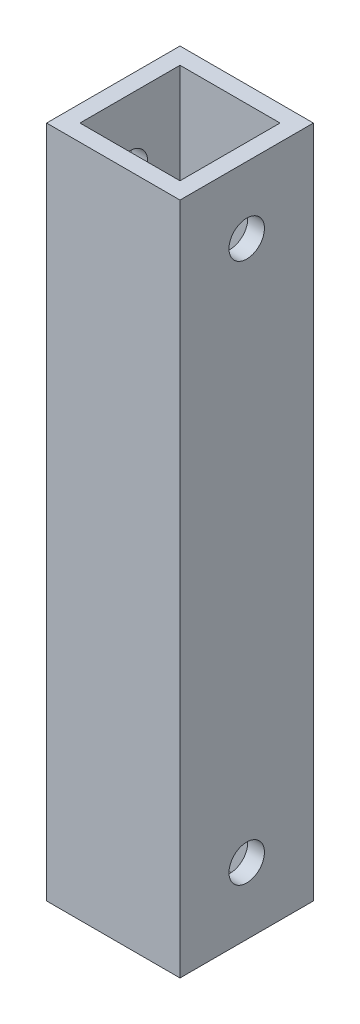
ISO-10303-21;
HEADER;
FILE_DESCRIPTION(('STEP AP214'),'2;1');
FILE_NAME('part.step','',(''),(''),'','','');
FILE_SCHEMA(('AUTOMOTIVE_DESIGN { 1 0 10303 214 1 1 1 1 }'));
ENDSEC;
DATA;
#1=APPLICATION_CONTEXT('core data for automotive mechanical design processes');
#2=APPLICATION_PROTOCOL_DEFINITION('international standard','automotive_design',2000,#1);
#3=PRODUCT_CONTEXT('',#1,'mechanical');
#4=PRODUCT('Part','Part','',(#3));
#5=PRODUCT_RELATED_PRODUCT_CATEGORY('part','',(#4));
#6=PRODUCT_DEFINITION_FORMATION('','',#4);
#7=PRODUCT_DEFINITION_CONTEXT('part definition',#1,'design');
#8=PRODUCT_DEFINITION('design','',#6,#7);
#9=PRODUCT_DEFINITION_SHAPE('','',#8);
#10=(LENGTH_UNIT() NAMED_UNIT(*) SI_UNIT(.MILLI.,.METRE.));
#11=(NAMED_UNIT(*) PLANE_ANGLE_UNIT() SI_UNIT($,.RADIAN.));
#12=(NAMED_UNIT(*) SI_UNIT($,.STERADIAN.) SOLID_ANGLE_UNIT());
#13=UNCERTAINTY_MEASURE_WITH_UNIT(LENGTH_MEASURE(1.E-05),#10,'distance_accuracy_value','');
#14=(GEOMETRIC_REPRESENTATION_CONTEXT(3) GLOBAL_UNCERTAINTY_ASSIGNED_CONTEXT((#13)) GLOBAL_UNIT_ASSIGNED_CONTEXT((#10,
#11,#12)) REPRESENTATION_CONTEXT('',''));
#15=CARTESIAN_POINT('',(0.,0.,0.));
#16=DIRECTION('',(0.,0.,1.));
#17=DIRECTION('',(1.,0.,0.));
#18=AXIS2_PLACEMENT_3D('',#15,#16,#17);
#19=CARTESIAN_POINT('',(0.,128.27,0.));
#20=DIRECTION('',(0.,-1.,0.));
#21=DIRECTION('',(0.,0.,-1.));
#22=AXIS2_PLACEMENT_3D('',#19,#20,#21);
#23=PLANE('',#22);
#24=DIRECTION('',(0.,0.,-1.));
#25=VECTOR('',#24,1.);
#26=CARTESIAN_POINT('',(12.7,128.27,12.7));
#27=LINE('',#26,#25);
#28=CARTESIAN_POINT('',(12.7,128.27,12.7));
#29=VERTEX_POINT('',#28);
#30=CARTESIAN_POINT('',(12.7,128.27,-12.7));
#31=VERTEX_POINT('',#30);
#32=EDGE_CURVE('E208',#29,#31,#27,.T.);
#33=ORIENTED_EDGE('',*,*,#32,.T.);
#34=DIRECTION('',(-1.,0.,0.));
#35=VECTOR('',#34,1.);
#36=CARTESIAN_POINT('',(-12.7,128.27,-12.7));
#37=LINE('',#36,#35);
#38=CARTESIAN_POINT('',(-12.7,128.27,-12.7));
#39=VERTEX_POINT('',#38);
#40=EDGE_CURVE('E211',#31,#39,#37,.T.);
#41=ORIENTED_EDGE('',*,*,#40,.T.);
#42=DIRECTION('',(0.,0.,1.));
#43=VECTOR('',#42,1.);
#44=CARTESIAN_POINT('',(-12.7,128.27,12.7));
#45=LINE('',#44,#43);
#46=CARTESIAN_POINT('',(-12.7,128.27,12.7));
#47=VERTEX_POINT('',#46);
#48=EDGE_CURVE('E214',#39,#47,#45,.T.);
#49=ORIENTED_EDGE('',*,*,#48,.T.);
#50=DIRECTION('',(1.,0.,0.));
#51=VECTOR('',#50,1.);
#52=CARTESIAN_POINT('',(-12.7,128.27,12.7));
#53=LINE('',#52,#51);
#54=EDGE_CURVE('E216',#47,#29,#53,.T.);
#55=ORIENTED_EDGE('',*,*,#54,.T.);
#56=EDGE_LOOP('',(#33,#41,#49,#55));
#57=FACE_BOUND('',#56,.T.);
#58=DIRECTION('',(0.,0.,1.));
#59=VECTOR('',#58,1.);
#60=CARTESIAN_POINT('',(-9.525,128.27,9.525));
#61=LINE('',#60,#59);
#62=CARTESIAN_POINT('',(-9.525,128.27,-9.525));
#63=VERTEX_POINT('',#62);
#64=CARTESIAN_POINT('',(-9.525,128.27,9.525));
#65=VERTEX_POINT('',#64);
#66=EDGE_CURVE('E176',#63,#65,#61,.T.);
#67=ORIENTED_EDGE('',*,*,#66,.F.);
#68=DIRECTION('',(-1.,0.,0.));
#69=VECTOR('',#68,1.);
#70=CARTESIAN_POINT('',(-9.525,128.27,-9.525));
#71=LINE('',#70,#69);
#72=CARTESIAN_POINT('',(9.525,128.27,-9.525));
#73=VERTEX_POINT('',#72);
#74=EDGE_CURVE('E184',#73,#63,#71,.T.);
#75=ORIENTED_EDGE('',*,*,#74,.F.);
#76=DIRECTION('',(0.,0.,-1.));
#77=VECTOR('',#76,1.);
#78=CARTESIAN_POINT('',(9.525,128.27,9.525));
#79=LINE('',#78,#77);
#80=CARTESIAN_POINT('',(9.525,128.27,9.525));
#81=VERTEX_POINT('',#80);
#82=EDGE_CURVE('E181',#81,#73,#79,.T.);
#83=ORIENTED_EDGE('',*,*,#82,.F.);
#84=DIRECTION('',(1.,0.,0.));
#85=VECTOR('',#84,1.);
#86=CARTESIAN_POINT('',(-9.525,128.27,9.525));
#87=LINE('',#86,#85);
#88=EDGE_CURVE('E178',#65,#81,#87,.T.);
#89=ORIENTED_EDGE('',*,*,#88,.F.);
#90=EDGE_LOOP('',(#67,#75,#83,#89));
#91=FACE_BOUND('',#90,.T.);
#92=ADVANCED_FACE('F33',(#57,#91),#23,.F.);
#93=CARTESIAN_POINT('',(0.,0.,0.));
#94=DIRECTION('',(0.,-1.,0.));
#95=DIRECTION('',(0.,0.,-1.));
#96=AXIS2_PLACEMENT_3D('',#93,#94,#95);
#97=PLANE('',#96);
#98=DIRECTION('',(0.,0.,-1.));
#99=VECTOR('',#98,1.);
#100=CARTESIAN_POINT('',(12.7,0.,12.7));
#101=LINE('',#100,#99);
#102=CARTESIAN_POINT('',(12.7,0.,12.7));
#103=VERTEX_POINT('',#102);
#104=CARTESIAN_POINT('',(12.7,0.,-12.7));
#105=VERTEX_POINT('',#104);
#106=EDGE_CURVE('E207',#103,#105,#101,.T.);
#107=ORIENTED_EDGE('',*,*,#106,.F.);
#108=DIRECTION('',(1.,0.,0.));
#109=VECTOR('',#108,1.);
#110=CARTESIAN_POINT('',(-12.7,0.,12.7));
#111=LINE('',#110,#109);
#112=CARTESIAN_POINT('',(-12.7,0.,12.7));
#113=VERTEX_POINT('',#112);
#114=EDGE_CURVE('E212',#113,#103,#111,.T.);
#115=ORIENTED_EDGE('',*,*,#114,.F.);
#116=DIRECTION('',(0.,0.,1.));
#117=VECTOR('',#116,1.);
#118=CARTESIAN_POINT('',(-12.7,0.,12.7));
#119=LINE('',#118,#117);
#120=CARTESIAN_POINT('',(-12.7,0.,-12.7));
#121=VERTEX_POINT('',#120);
#122=EDGE_CURVE('E224',#121,#113,#119,.T.);
#123=ORIENTED_EDGE('',*,*,#122,.F.);
#124=DIRECTION('',(-1.,0.,0.));
#125=VECTOR('',#124,1.);
#126=CARTESIAN_POINT('',(-12.7,0.,-12.7));
#127=LINE('',#126,#125);
#128=EDGE_CURVE('E221',#105,#121,#127,.T.);
#129=ORIENTED_EDGE('',*,*,#128,.F.);
#130=EDGE_LOOP('',(#107,#115,#123,#129));
#131=FACE_BOUND('',#130,.T.);
#132=DIRECTION('',(-1.,0.,0.));
#133=VECTOR('',#132,1.);
#134=CARTESIAN_POINT('',(-9.525,0.,-9.525));
#135=LINE('',#134,#133);
#136=CARTESIAN_POINT('',(9.525,0.,-9.525));
#137=VERTEX_POINT('',#136);
#138=CARTESIAN_POINT('',(-9.525,0.,-9.525));
#139=VERTEX_POINT('',#138);
#140=EDGE_CURVE('E179',#137,#139,#135,.T.);
#141=ORIENTED_EDGE('',*,*,#140,.T.);
#142=DIRECTION('',(0.,0.,1.));
#143=VECTOR('',#142,1.);
#144=CARTESIAN_POINT('',(-9.525,0.,9.525));
#145=LINE('',#144,#143);
#146=CARTESIAN_POINT('',(-9.525,0.,9.525));
#147=VERTEX_POINT('',#146);
#148=EDGE_CURVE('E175',#139,#147,#145,.T.);
#149=ORIENTED_EDGE('',*,*,#148,.T.);
#150=DIRECTION('',(1.,0.,0.));
#151=VECTOR('',#150,1.);
#152=CARTESIAN_POINT('',(-9.525,0.,9.525));
#153=LINE('',#152,#151);
#154=CARTESIAN_POINT('',(9.525,0.,9.525));
#155=VERTEX_POINT('',#154);
#156=EDGE_CURVE('E189',#147,#155,#153,.T.);
#157=ORIENTED_EDGE('',*,*,#156,.T.);
#158=DIRECTION('',(0.,0.,-1.));
#159=VECTOR('',#158,1.);
#160=CARTESIAN_POINT('',(9.525,0.,9.525));
#161=LINE('',#160,#159);
#162=EDGE_CURVE('E192',#155,#137,#161,.T.);
#163=ORIENTED_EDGE('',*,*,#162,.T.);
#164=EDGE_LOOP('',(#141,#149,#157,#163));
#165=FACE_BOUND('',#164,.T.);
#166=ADVANCED_FACE('F288',(#131,#165),#97,.T.);
#167=CARTESIAN_POINT('',(12.7,128.27,12.7));
#168=DIRECTION('',(-1.,0.,0.));
#169=DIRECTION('',(0.,0.,1.));
#170=AXIS2_PLACEMENT_3D('',#167,#168,#169);
#171=PLANE('',#170);
#172=CARTESIAN_POINT('',(12.7,12.7,0.));
#173=DIRECTION('',(1.,0.,0.));
#174=DIRECTION('',(0.,0.,-1.));
#175=AXIS2_PLACEMENT_3D('',#172,#173,#174);
#176=CIRCLE('',#175,3.3734375);
#177=CARTESIAN_POINT('',(12.7,12.7,-3.3734375));
#178=VERTEX_POINT('',#177);
#179=EDGE_CURVE('E423',#178,#178,#176,.T.);
#180=ORIENTED_EDGE('',*,*,#179,.F.);
#181=EDGE_LOOP('',(#180));
#182=FACE_BOUND('',#181,.T.);
#183=CARTESIAN_POINT('',(12.7,115.57,0.));
#184=DIRECTION('',(1.,0.,0.));
#185=DIRECTION('',(0.,0.,-1.));
#186=AXIS2_PLACEMENT_3D('',#183,#184,#185);
#187=CIRCLE('',#186,3.3734375);
#188=CARTESIAN_POINT('',(12.7,115.57,-3.3734375));
#189=VERTEX_POINT('',#188);
#190=EDGE_CURVE('E249',#189,#189,#187,.T.);
#191=ORIENTED_EDGE('',*,*,#190,.F.);
#192=EDGE_LOOP('',(#191));
#193=FACE_BOUND('',#192,.T.);
#194=ORIENTED_EDGE('',*,*,#106,.T.);
#195=DIRECTION('',(0.,-1.,0.));
#196=VECTOR('',#195,1.);
#197=CARTESIAN_POINT('',(12.7,128.27,-12.7));
#198=LINE('',#197,#196);
#199=EDGE_CURVE('E235',#31,#105,#198,.T.);
#200=ORIENTED_EDGE('',*,*,#199,.F.);
#201=ORIENTED_EDGE('',*,*,#32,.F.);
#202=DIRECTION('',(0.,-1.,0.));
#203=VECTOR('',#202,1.);
#204=CARTESIAN_POINT('',(12.7,128.27,12.7));
#205=LINE('',#204,#203);
#206=EDGE_CURVE('E218',#29,#103,#205,.T.);
#207=ORIENTED_EDGE('',*,*,#206,.T.);
#208=EDGE_LOOP('',(#194,#200,#201,#207));
#209=FACE_BOUND('',#208,.T.);
#210=ADVANCED_FACE('F35',(#182,#193,#209),#171,.F.);
#211=CARTESIAN_POINT('',(-12.7,128.27,-12.7));
#212=DIRECTION('',(0.,0.,1.));
#213=DIRECTION('',(1.,0.,0.));
#214=AXIS2_PLACEMENT_3D('',#211,#212,#213);
#215=PLANE('',#214);
#216=DIRECTION('',(0.,-1.,0.));
#217=VECTOR('',#216,1.);
#218=CARTESIAN_POINT('',(-12.7,128.27,-12.7));
#219=LINE('',#218,#217);
#220=CARTESIAN_POINT('',(-12.7,38.1,-12.7));
#221=VERTEX_POINT('',#220);
#222=EDGE_CURVE('E232',#221,#121,#219,.T.);
#223=ORIENTED_EDGE('',*,*,#222,.F.);
#224=DIRECTION('',(-1.,0.,0.));
#225=VECTOR('',#224,1.);
#226=CARTESIAN_POINT('',(-41.6854634885415,38.1,-12.7));
#227=LINE('',#226,#225);
#228=CARTESIAN_POINT('',(5.08,38.1,-12.7));
#229=VERTEX_POINT('',#228);
#230=EDGE_CURVE('E158',#229,#221,#227,.T.);
#231=ORIENTED_EDGE('',*,*,#230,.F.);
#232=DIRECTION('',(0.,-1.,0.));
#233=VECTOR('',#232,1.);
#234=CARTESIAN_POINT('',(5.08,38.1,-12.7));
#235=LINE('',#234,#233);
#236=CARTESIAN_POINT('',(5.08,50.8,-12.7));
#237=VERTEX_POINT('',#236);
#238=EDGE_CURVE('E138',#237,#229,#235,.T.);
#239=ORIENTED_EDGE('',*,*,#238,.F.);
#240=DIRECTION('',(1.,0.,0.));
#241=VECTOR('',#240,1.);
#242=CARTESIAN_POINT('',(-41.6854634885415,50.8,-12.7));
#243=LINE('',#242,#241);
#244=CARTESIAN_POINT('',(-12.7,50.8,-12.7));
#245=VERTEX_POINT('',#244);
#246=EDGE_CURVE('E146',#245,#237,#243,.T.);
#247=ORIENTED_EDGE('',*,*,#246,.F.);
#248=EDGE_CURVE('E233',#39,#245,#219,.T.);
#249=ORIENTED_EDGE('',*,*,#248,.F.);
#250=ORIENTED_EDGE('',*,*,#40,.F.);
#251=ORIENTED_EDGE('',*,*,#199,.T.);
#252=ORIENTED_EDGE('',*,*,#128,.T.);
#253=EDGE_LOOP('',(#223,#231,#239,#247,#249,#250,#251,#252));
#254=FACE_BOUND('',#253,.T.);
#255=ADVANCED_FACE('F157',(#254),#215,.F.);
#256=CARTESIAN_POINT('',(-12.7,128.27,12.7));
#257=DIRECTION('',(1.,0.,0.));
#258=DIRECTION('',(0.,0.,-1.));
#259=AXIS2_PLACEMENT_3D('',#256,#257,#258);
#260=PLANE('',#259);
#261=CARTESIAN_POINT('',(-12.7,12.7,0.));
#262=DIRECTION('',(1.,0.,0.));
#263=DIRECTION('',(0.,0.,-1.));
#264=AXIS2_PLACEMENT_3D('',#261,#262,#263);
#265=CIRCLE('',#264,3.3734375);
#266=CARTESIAN_POINT('',(-12.7,12.7,-3.3734375));
#267=VERTEX_POINT('',#266);
#268=EDGE_CURVE('E422',#267,#267,#265,.T.);
#269=ORIENTED_EDGE('',*,*,#268,.T.);
#270=EDGE_LOOP('',(#269));
#271=FACE_BOUND('',#270,.T.);
#272=CARTESIAN_POINT('',(-12.7,115.57,0.));
#273=DIRECTION('',(1.,0.,0.));
#274=DIRECTION('',(0.,0.,-1.));
#275=AXIS2_PLACEMENT_3D('',#272,#273,#274);
#276=CIRCLE('',#275,3.3734375);
#277=CARTESIAN_POINT('',(-12.7,115.57,-3.3734375));
#278=VERTEX_POINT('',#277);
#279=EDGE_CURVE('E243',#278,#278,#276,.T.);
#280=ORIENTED_EDGE('',*,*,#279,.T.);
#281=EDGE_LOOP('',(#280));
#282=FACE_BOUND('',#281,.T.);
#283=DIRECTION('',(0.,1.,0.));
#284=VECTOR('',#283,1.);
#285=CARTESIAN_POINT('',(-12.7,128.27,0.));
#286=LINE('',#285,#284);
#287=CARTESIAN_POINT('',(-12.7,38.1,0.));
#288=VERTEX_POINT('',#287);
#289=CARTESIAN_POINT('',(-12.7,50.8,0.));
#290=VERTEX_POINT('',#289);
#291=EDGE_CURVE('E173',#288,#290,#286,.T.);
#292=ORIENTED_EDGE('',*,*,#291,.F.);
#293=DIRECTION('',(0.,0.,-1.));
#294=VECTOR('',#293,1.);
#295=CARTESIAN_POINT('',(-12.7,38.1,12.7));
#296=LINE('',#295,#294);
#297=EDGE_CURVE('E170',#288,#221,#296,.T.);
#298=ORIENTED_EDGE('',*,*,#297,.T.);
#299=ORIENTED_EDGE('',*,*,#222,.T.);
#300=ORIENTED_EDGE('',*,*,#122,.T.);
#301=DIRECTION('',(0.,-1.,0.));
#302=VECTOR('',#301,1.);
#303=CARTESIAN_POINT('',(-12.7,128.27,12.7));
#304=LINE('',#303,#302);
#305=EDGE_CURVE('E229',#47,#113,#304,.T.);
#306=ORIENTED_EDGE('',*,*,#305,.F.);
#307=ORIENTED_EDGE('',*,*,#48,.F.);
#308=ORIENTED_EDGE('',*,*,#248,.T.);
#309=DIRECTION('',(0.,0.,1.));
#310=VECTOR('',#309,1.);
#311=CARTESIAN_POINT('',(-12.7,50.8,12.7));
#312=LINE('',#311,#310);
#313=EDGE_CURVE('E150',#245,#290,#312,.T.);
#314=ORIENTED_EDGE('',*,*,#313,.T.);
#315=EDGE_LOOP('',(#292,#298,#299,#300,#306,#307,#308,#314));
#316=FACE_BOUND('',#315,.T.);
#317=ADVANCED_FACE('F306',(#271,#282,#316),#260,.F.);
#318=CARTESIAN_POINT('',(-12.7,128.27,12.7));
#319=DIRECTION('',(0.,0.,-1.));
#320=DIRECTION('',(-1.,0.,0.));
#321=AXIS2_PLACEMENT_3D('',#318,#319,#320);
#322=PLANE('',#321);
#323=ORIENTED_EDGE('',*,*,#114,.T.);
#324=ORIENTED_EDGE('',*,*,#206,.F.);
#325=ORIENTED_EDGE('',*,*,#54,.F.);
#326=ORIENTED_EDGE('',*,*,#305,.T.);
#327=EDGE_LOOP('',(#323,#324,#325,#326));
#328=FACE_BOUND('',#327,.T.);
#329=ADVANCED_FACE('F303',(#328),#322,.F.);
#330=CARTESIAN_POINT('',(-9.525,128.27,9.525));
#331=DIRECTION('',(1.,0.,0.));
#332=DIRECTION('',(0.,0.,-1.));
#333=AXIS2_PLACEMENT_3D('',#330,#331,#332);
#334=PLANE('',#333);
#335=CARTESIAN_POINT('',(-9.525,12.7,0.));
#336=DIRECTION('',(1.,0.,0.));
#337=DIRECTION('',(0.,0.,-1.));
#338=AXIS2_PLACEMENT_3D('',#335,#336,#337);
#339=CIRCLE('',#338,3.3734375);
#340=CARTESIAN_POINT('',(-9.525,12.7,-3.3734375));
#341=VERTEX_POINT('',#340);
#342=EDGE_CURVE('E254',#341,#341,#339,.T.);
#343=ORIENTED_EDGE('',*,*,#342,.F.);
#344=EDGE_LOOP('',(#343));
#345=FACE_BOUND('',#344,.T.);
#346=CARTESIAN_POINT('',(-9.525,115.57,0.));
#347=DIRECTION('',(1.,0.,0.));
#348=DIRECTION('',(0.,0.,-1.));
#349=AXIS2_PLACEMENT_3D('',#346,#347,#348);
#350=CIRCLE('',#349,3.3734375);
#351=CARTESIAN_POINT('',(-9.525,115.57,-3.3734375));
#352=VERTEX_POINT('',#351);
#353=EDGE_CURVE('E154',#352,#352,#350,.T.);
#354=ORIENTED_EDGE('',*,*,#353,.F.);
#355=EDGE_LOOP('',(#354));
#356=FACE_BOUND('',#355,.T.);
#357=DIRECTION('',(0.,0.,-1.));
#358=VECTOR('',#357,1.);
#359=CARTESIAN_POINT('',(-9.525,38.1,9.525));
#360=LINE('',#359,#358);
#361=CARTESIAN_POINT('',(-9.525,38.1,0.));
#362=VERTEX_POINT('',#361);
#363=CARTESIAN_POINT('',(-9.525,38.1,-9.525));
#364=VERTEX_POINT('',#363);
#365=EDGE_CURVE('E168',#362,#364,#360,.T.);
#366=ORIENTED_EDGE('',*,*,#365,.F.);
#367=DIRECTION('',(0.,1.,0.));
#368=VECTOR('',#367,1.);
#369=CARTESIAN_POINT('',(-9.525,128.27,0.));
#370=LINE('',#369,#368);
#371=CARTESIAN_POINT('',(-9.525,50.8,0.));
#372=VERTEX_POINT('',#371);
#373=EDGE_CURVE('E11',#362,#372,#370,.T.);
#374=ORIENTED_EDGE('',*,*,#373,.T.);
#375=DIRECTION('',(0.,0.,1.));
#376=VECTOR('',#375,1.);
#377=CARTESIAN_POINT('',(-9.525,50.8,9.525));
#378=LINE('',#377,#376);
#379=CARTESIAN_POINT('',(-9.525,50.8,-9.525));
#380=VERTEX_POINT('',#379);
#381=EDGE_CURVE('E164',#380,#372,#378,.T.);
#382=ORIENTED_EDGE('',*,*,#381,.F.);
#383=DIRECTION('',(0.,-1.,0.));
#384=VECTOR('',#383,1.);
#385=CARTESIAN_POINT('',(-9.525,128.27,-9.525));
#386=LINE('',#385,#384);
#387=EDGE_CURVE('E197',#63,#380,#386,.T.);
#388=ORIENTED_EDGE('',*,*,#387,.F.);
#389=ORIENTED_EDGE('',*,*,#66,.T.);
#390=DIRECTION('',(0.,-1.,0.));
#391=VECTOR('',#390,1.);
#392=CARTESIAN_POINT('',(-9.525,128.27,9.525));
#393=LINE('',#392,#391);
#394=EDGE_CURVE('E204',#65,#147,#393,.T.);
#395=ORIENTED_EDGE('',*,*,#394,.T.);
#396=ORIENTED_EDGE('',*,*,#148,.F.);
#397=EDGE_CURVE('E186',#364,#139,#386,.T.);
#398=ORIENTED_EDGE('',*,*,#397,.F.);
#399=EDGE_LOOP('',(#366,#374,#382,#388,#389,#395,#396,#398));
#400=FACE_BOUND('',#399,.T.);
#401=ADVANCED_FACE('F265',(#345,#356,#400),#334,.T.);
#402=CARTESIAN_POINT('',(-9.525,128.27,9.525));
#403=DIRECTION('',(0.,0.,-1.));
#404=DIRECTION('',(-1.,0.,0.));
#405=AXIS2_PLACEMENT_3D('',#402,#403,#404);
#406=PLANE('',#405);
#407=ORIENTED_EDGE('',*,*,#156,.F.);
#408=ORIENTED_EDGE('',*,*,#394,.F.);
#409=ORIENTED_EDGE('',*,*,#88,.T.);
#410=DIRECTION('',(0.,-1.,0.));
#411=VECTOR('',#410,1.);
#412=CARTESIAN_POINT('',(9.525,128.27,9.525));
#413=LINE('',#412,#411);
#414=EDGE_CURVE('E202',#81,#155,#413,.T.);
#415=ORIENTED_EDGE('',*,*,#414,.T.);
#416=EDGE_LOOP('',(#407,#408,#409,#415));
#417=FACE_BOUND('',#416,.T.);
#418=ADVANCED_FACE('F283',(#417),#406,.T.);
#419=CARTESIAN_POINT('',(9.525,128.27,9.525));
#420=DIRECTION('',(-1.,0.,0.));
#421=DIRECTION('',(0.,0.,1.));
#422=AXIS2_PLACEMENT_3D('',#419,#420,#421);
#423=PLANE('',#422);
#424=CARTESIAN_POINT('',(9.525,12.7,0.));
#425=DIRECTION('',(-1.,0.,0.));
#426=DIRECTION('',(0.,0.,1.));
#427=AXIS2_PLACEMENT_3D('',#424,#425,#426);
#428=CIRCLE('',#427,3.3734375);
#429=CARTESIAN_POINT('',(9.525,12.7,3.3734375));
#430=VERTEX_POINT('',#429);
#431=EDGE_CURVE('E37',#430,#430,#428,.T.);
#432=ORIENTED_EDGE('',*,*,#431,.F.);
#433=EDGE_LOOP('',(#432));
#434=FACE_BOUND('',#433,.T.);
#435=CARTESIAN_POINT('',(9.525,115.57,0.));
#436=DIRECTION('',(-1.,0.,0.));
#437=DIRECTION('',(0.,0.,1.));
#438=AXIS2_PLACEMENT_3D('',#435,#436,#437);
#439=CIRCLE('',#438,3.3734375);
#440=CARTESIAN_POINT('',(9.525,115.57,3.3734375));
#441=VERTEX_POINT('',#440);
#442=EDGE_CURVE('E241',#441,#441,#439,.T.);
#443=ORIENTED_EDGE('',*,*,#442,.F.);
#444=EDGE_LOOP('',(#443));
#445=FACE_BOUND('',#444,.T.);
#446=ORIENTED_EDGE('',*,*,#162,.F.);
#447=ORIENTED_EDGE('',*,*,#414,.F.);
#448=ORIENTED_EDGE('',*,*,#82,.T.);
#449=DIRECTION('',(0.,-1.,0.));
#450=VECTOR('',#449,1.);
#451=CARTESIAN_POINT('',(9.525,128.27,-9.525));
#452=LINE('',#451,#450);
#453=EDGE_CURVE('E200',#73,#137,#452,.T.);
#454=ORIENTED_EDGE('',*,*,#453,.T.);
#455=EDGE_LOOP('',(#446,#447,#448,#454));
#456=FACE_BOUND('',#455,.T.);
#457=ADVANCED_FACE('F286',(#434,#445,#456),#423,.T.);
#458=CARTESIAN_POINT('',(-9.525,128.27,-9.525));
#459=DIRECTION('',(0.,0.,1.));
#460=DIRECTION('',(1.,0.,0.));
#461=AXIS2_PLACEMENT_3D('',#458,#459,#460);
#462=PLANE('',#461);
#463=DIRECTION('',(1.,0.,0.));
#464=VECTOR('',#463,1.);
#465=CARTESIAN_POINT('',(-9.52500000000001,38.1,-9.525));
#466=LINE('',#465,#464);
#467=CARTESIAN_POINT('',(5.08,38.1,-9.525));
#468=VERTEX_POINT('',#467);
#469=EDGE_CURVE('E42',#364,#468,#466,.T.);
#470=ORIENTED_EDGE('',*,*,#469,.F.);
#471=ORIENTED_EDGE('',*,*,#397,.T.);
#472=ORIENTED_EDGE('',*,*,#140,.F.);
#473=ORIENTED_EDGE('',*,*,#453,.F.);
#474=ORIENTED_EDGE('',*,*,#74,.T.);
#475=ORIENTED_EDGE('',*,*,#387,.T.);
#476=DIRECTION('',(-1.,0.,0.));
#477=VECTOR('',#476,1.);
#478=CARTESIAN_POINT('',(-9.52500000000001,50.8,-9.525));
#479=LINE('',#478,#477);
#480=CARTESIAN_POINT('',(5.08,50.8,-9.525));
#481=VERTEX_POINT('',#480);
#482=EDGE_CURVE('E238',#481,#380,#479,.T.);
#483=ORIENTED_EDGE('',*,*,#482,.F.);
#484=DIRECTION('',(0.,1.,0.));
#485=VECTOR('',#484,1.);
#486=CARTESIAN_POINT('',(5.08000000000001,128.27,-9.525));
#487=LINE('',#486,#485);
#488=EDGE_CURVE('E141',#468,#481,#487,.T.);
#489=ORIENTED_EDGE('',*,*,#488,.F.);
#490=EDGE_LOOP('',(#470,#471,#472,#473,#474,#475,#483,#489));
#491=FACE_BOUND('',#490,.T.);
#492=ADVANCED_FACE('F273',(#491),#462,.T.);
#493=CARTESIAN_POINT('',(0.,0.,0.));
#494=DIRECTION('',(0.,0.,-1.));
#495=DIRECTION('',(-1.,0.,0.));
#496=AXIS2_PLACEMENT_3D('',#493,#494,#495);
#497=PLANE('',#496);
#498=ORIENTED_EDGE('',*,*,#291,.T.);
#499=DIRECTION('',(1.,0.,0.));
#500=VECTOR('',#499,1.);
#501=CARTESIAN_POINT('',(-41.6854634885415,50.8,0.));
#502=LINE('',#501,#500);
#503=EDGE_CURVE('E160',#290,#372,#502,.T.);
#504=ORIENTED_EDGE('',*,*,#503,.T.);
#505=ORIENTED_EDGE('',*,*,#373,.F.);
#506=DIRECTION('',(-1.,0.,0.));
#507=VECTOR('',#506,1.);
#508=CARTESIAN_POINT('',(-41.6854634885415,38.1,0.));
#509=LINE('',#508,#507);
#510=EDGE_CURVE('E50',#362,#288,#509,.T.);
#511=ORIENTED_EDGE('',*,*,#510,.T.);
#512=EDGE_LOOP('',(#498,#504,#505,#511));
#513=FACE_BOUND('',#512,.T.);
#514=ADVANCED_FACE('F260',(#513),#497,.T.);
#515=CARTESIAN_POINT('',(-41.6854634885415,38.1,0.));
#516=DIRECTION('',(0.,-1.,0.));
#517=DIRECTION('',(1.,0.,0.));
#518=AXIS2_PLACEMENT_3D('',#515,#516,#517);
#519=PLANE('',#518);
#520=ORIENTED_EDGE('',*,*,#510,.F.);
#521=ORIENTED_EDGE('',*,*,#365,.T.);
#522=ORIENTED_EDGE('',*,*,#469,.T.);
#523=DIRECTION('',(0.,0.,-1.));
#524=VECTOR('',#523,1.);
#525=CARTESIAN_POINT('',(5.08,38.1,0.));
#526=LINE('',#525,#524);
#527=EDGE_CURVE('E143',#468,#229,#526,.T.);
#528=ORIENTED_EDGE('',*,*,#527,.T.);
#529=ORIENTED_EDGE('',*,*,#230,.T.);
#530=ORIENTED_EDGE('',*,*,#297,.F.);
#531=EDGE_LOOP('',(#520,#521,#522,#528,#529,#530));
#532=FACE_BOUND('',#531,.T.);
#533=ADVANCED_FACE('F271',(#532),#519,.F.);
#534=CARTESIAN_POINT('',(-41.6854634885415,50.8,0.));
#535=DIRECTION('',(0.,1.,0.));
#536=DIRECTION('',(-1.,0.,0.));
#537=AXIS2_PLACEMENT_3D('',#534,#535,#536);
#538=PLANE('',#537);
#539=ORIENTED_EDGE('',*,*,#246,.T.);
#540=DIRECTION('',(0.,0.,-1.));
#541=VECTOR('',#540,1.);
#542=CARTESIAN_POINT('',(5.08,50.8,0.));
#543=LINE('',#542,#541);
#544=EDGE_CURVE('E58',#481,#237,#543,.T.);
#545=ORIENTED_EDGE('',*,*,#544,.F.);
#546=ORIENTED_EDGE('',*,*,#482,.T.);
#547=ORIENTED_EDGE('',*,*,#381,.T.);
#548=ORIENTED_EDGE('',*,*,#503,.F.);
#549=ORIENTED_EDGE('',*,*,#313,.F.);
#550=EDGE_LOOP('',(#539,#545,#546,#547,#548,#549));
#551=FACE_BOUND('',#550,.T.);
#552=ADVANCED_FACE('F147',(#551),#538,.F.);
#553=CARTESIAN_POINT('',(5.08,38.1,0.));
#554=DIRECTION('',(1.,0.,0.));
#555=DIRECTION('',(0.,1.,0.));
#556=AXIS2_PLACEMENT_3D('',#553,#554,#555);
#557=PLANE('',#556);
#558=ORIENTED_EDGE('',*,*,#488,.T.);
#559=ORIENTED_EDGE('',*,*,#544,.T.);
#560=ORIENTED_EDGE('',*,*,#238,.T.);
#561=ORIENTED_EDGE('',*,*,#527,.F.);
#562=EDGE_LOOP('',(#558,#559,#560,#561));
#563=FACE_BOUND('',#562,.T.);
#564=ADVANCED_FACE('F135',(#563),#557,.F.);
#565=CARTESIAN_POINT('',(-12.7,115.57,0.));
#566=DIRECTION('',(1.,0.,0.));
#567=DIRECTION('',(0.,0.,-1.));
#568=AXIS2_PLACEMENT_3D('',#565,#566,#567);
#569=CYLINDRICAL_SURFACE('',#568,3.3734375);
#570=ORIENTED_EDGE('',*,*,#442,.T.);
#571=EDGE_LOOP('',(#570));
#572=FACE_BOUND('',#571,.T.);
#573=ORIENTED_EDGE('',*,*,#190,.T.);
#574=EDGE_LOOP('',(#573));
#575=FACE_BOUND('',#574,.T.);
#576=ADVANCED_FACE('F356',(#572,#575),#569,.F.);
#577=ORIENTED_EDGE('',*,*,#353,.T.);
#578=EDGE_LOOP('',(#577));
#579=FACE_BOUND('',#578,.T.);
#580=ORIENTED_EDGE('',*,*,#279,.F.);
#581=EDGE_LOOP('',(#580));
#582=FACE_BOUND('',#581,.T.);
#583=ADVANCED_FACE('F384',(#579,#582),#569,.F.);
#584=CARTESIAN_POINT('',(-12.7,12.7,0.));
#585=DIRECTION('',(1.,0.,0.));
#586=DIRECTION('',(0.,0.,-1.));
#587=AXIS2_PLACEMENT_3D('',#584,#585,#586);
#588=CYLINDRICAL_SURFACE('',#587,3.3734375);
#589=ORIENTED_EDGE('',*,*,#431,.T.);
#590=EDGE_LOOP('',(#589));
#591=FACE_BOUND('',#590,.T.);
#592=ORIENTED_EDGE('',*,*,#179,.T.);
#593=EDGE_LOOP('',(#592));
#594=FACE_BOUND('',#593,.T.);
#595=ADVANCED_FACE('F393',(#591,#594),#588,.F.);
#596=ORIENTED_EDGE('',*,*,#342,.T.);
#597=EDGE_LOOP('',(#596));
#598=FACE_BOUND('',#597,.T.);
#599=ORIENTED_EDGE('',*,*,#268,.F.);
#600=EDGE_LOOP('',(#599));
#601=FACE_BOUND('',#600,.T.);
#602=ADVANCED_FACE('F402',(#598,#601),#588,.F.);
#603=CLOSED_SHELL('',(#92,#166,#210,#255,#317,#329,#401,#418,#457,#492,#514,#533,#552,#564,#576,
#583,#595,#602));
#604=MANIFOLD_SOLID_BREP('B2',#603);
#605=ADVANCED_BREP_SHAPE_REPRESENTATION('',(#18,#604),#14);
#606=SHAPE_DEFINITION_REPRESENTATION(#9,#605);
ENDSEC;
END-ISO-10303-21;
